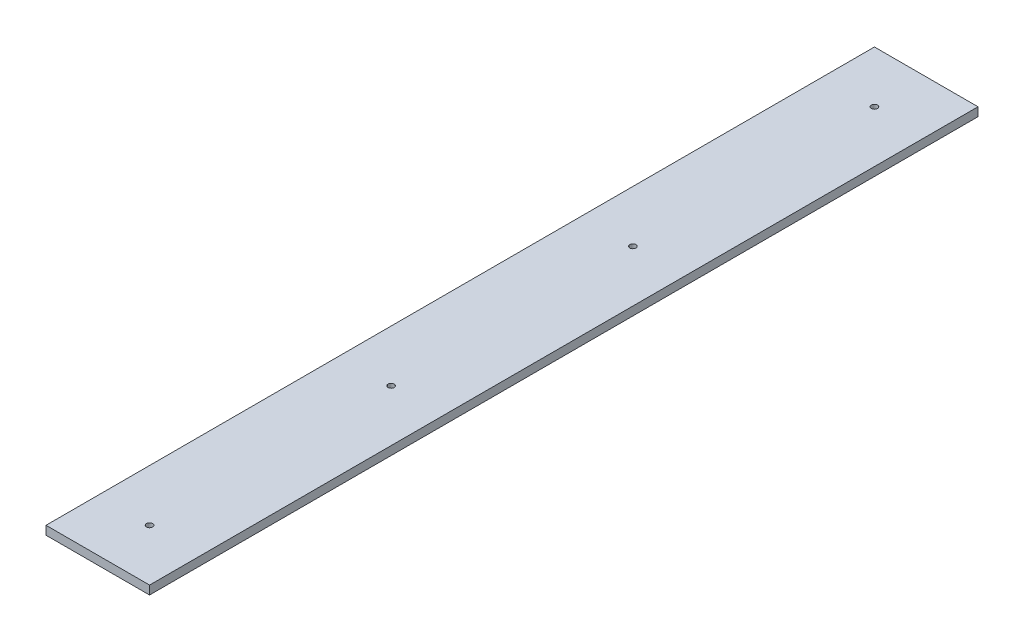
ISO-10303-21;
HEADER;
FILE_DESCRIPTION(('STEP AP214'),'2;1');
FILE_NAME('part.step','',(''),(''),'','','');
FILE_SCHEMA(('AUTOMOTIVE_DESIGN { 1 0 10303 214 1 1 1 1 }'));
ENDSEC;
DATA;
#1=APPLICATION_CONTEXT('core data for automotive mechanical design processes');
#2=APPLICATION_PROTOCOL_DEFINITION('international standard','automotive_design',2000,#1);
#3=PRODUCT_CONTEXT('',#1,'mechanical');
#4=PRODUCT('Part','Part','',(#3));
#5=PRODUCT_RELATED_PRODUCT_CATEGORY('part','',(#4));
#6=PRODUCT_DEFINITION_FORMATION('','',#4);
#7=PRODUCT_DEFINITION_CONTEXT('part definition',#1,'design');
#8=PRODUCT_DEFINITION('design','',#6,#7);
#9=PRODUCT_DEFINITION_SHAPE('','',#8);
#10=(LENGTH_UNIT() NAMED_UNIT(*) SI_UNIT(.MILLI.,.METRE.));
#11=(NAMED_UNIT(*) PLANE_ANGLE_UNIT() SI_UNIT($,.RADIAN.));
#12=(NAMED_UNIT(*) SI_UNIT($,.STERADIAN.) SOLID_ANGLE_UNIT());
#13=UNCERTAINTY_MEASURE_WITH_UNIT(LENGTH_MEASURE(1.E-05),#10,'distance_accuracy_value','');
#14=(GEOMETRIC_REPRESENTATION_CONTEXT(3) GLOBAL_UNCERTAINTY_ASSIGNED_CONTEXT((#13)) GLOBAL_UNIT_ASSIGNED_CONTEXT((#10,
#11,#12)) REPRESENTATION_CONTEXT('',''));
#15=CARTESIAN_POINT('',(0.,0.,0.));
#16=DIRECTION('',(0.,0.,1.));
#17=DIRECTION('',(1.,0.,0.));
#18=AXIS2_PLACEMENT_3D('',#15,#16,#17);
#19=CARTESIAN_POINT('',(0.,6.35,0.));
#20=DIRECTION('',(1.,0.,0.));
#21=DIRECTION('',(0.,0.,-1.));
#22=AXIS2_PLACEMENT_3D('',#19,#20,#21);
#23=PLANE('',#22);
#24=DIRECTION('',(0.,0.,1.));
#25=VECTOR('',#24,1.);
#26=CARTESIAN_POINT('',(0.,0.,0.));
#27=LINE('',#26,#25);
#28=CARTESIAN_POINT('',(0.,0.,-609.6));
#29=VERTEX_POINT('',#28);
#30=CARTESIAN_POINT('',(0.,0.,0.));
#31=VERTEX_POINT('',#30);
#32=EDGE_CURVE('E97',#29,#31,#27,.T.);
#33=ORIENTED_EDGE('',*,*,#32,.T.);
#34=DIRECTION('',(0.,-1.,0.));
#35=VECTOR('',#34,1.);
#36=CARTESIAN_POINT('',(0.,6.35,0.));
#37=LINE('',#36,#35);
#38=CARTESIAN_POINT('',(0.,6.35,0.));
#39=VERTEX_POINT('',#38);
#40=EDGE_CURVE('E11',#39,#31,#37,.T.);
#41=ORIENTED_EDGE('',*,*,#40,.F.);
#42=DIRECTION('',(0.,0.,1.));
#43=VECTOR('',#42,1.);
#44=CARTESIAN_POINT('',(0.,6.35,0.));
#45=LINE('',#44,#43);
#46=CARTESIAN_POINT('',(0.,6.35,-609.6));
#47=VERTEX_POINT('',#46);
#48=EDGE_CURVE('E85',#47,#39,#45,.T.);
#49=ORIENTED_EDGE('',*,*,#48,.F.);
#50=DIRECTION('',(0.,-1.,0.));
#51=VECTOR('',#50,1.);
#52=CARTESIAN_POINT('',(0.,6.35,-609.6));
#53=LINE('',#52,#51);
#54=EDGE_CURVE('E93',#47,#29,#53,.T.);
#55=ORIENTED_EDGE('',*,*,#54,.T.);
#56=EDGE_LOOP('',(#33,#41,#49,#55));
#57=FACE_BOUND('',#56,.T.);
#58=ADVANCED_FACE('F34',(#57),#23,.F.);
#59=CARTESIAN_POINT('',(0.,6.35,0.));
#60=DIRECTION('',(0.,0.,-1.));
#61=DIRECTION('',(-1.,0.,0.));
#62=AXIS2_PLACEMENT_3D('',#59,#60,#61);
#63=PLANE('',#62);
#64=DIRECTION('',(1.,0.,0.));
#65=VECTOR('',#64,1.);
#66=CARTESIAN_POINT('',(0.,0.,0.));
#67=LINE('',#66,#65);
#68=CARTESIAN_POINT('',(76.2,0.,0.));
#69=VERTEX_POINT('',#68);
#70=EDGE_CURVE('E89',#31,#69,#67,.T.);
#71=ORIENTED_EDGE('',*,*,#70,.T.);
#72=DIRECTION('',(0.,-1.,0.));
#73=VECTOR('',#72,1.);
#74=CARTESIAN_POINT('',(76.2,6.35,0.));
#75=LINE('',#74,#73);
#76=CARTESIAN_POINT('',(76.2,6.35,0.));
#77=VERTEX_POINT('',#76);
#78=EDGE_CURVE('E42',#77,#69,#75,.T.);
#79=ORIENTED_EDGE('',*,*,#78,.F.);
#80=DIRECTION('',(1.,0.,0.));
#81=VECTOR('',#80,1.);
#82=CARTESIAN_POINT('',(0.,6.35,0.));
#83=LINE('',#82,#81);
#84=EDGE_CURVE('E80',#39,#77,#83,.T.);
#85=ORIENTED_EDGE('',*,*,#84,.F.);
#86=ORIENTED_EDGE('',*,*,#40,.T.);
#87=EDGE_LOOP('',(#71,#79,#85,#86));
#88=FACE_BOUND('',#87,.T.);
#89=ADVANCED_FACE('F88',(#88),#63,.F.);
#90=CARTESIAN_POINT('',(76.2,6.35,0.));
#91=DIRECTION('',(-1.,0.,0.));
#92=DIRECTION('',(0.,0.,1.));
#93=AXIS2_PLACEMENT_3D('',#90,#91,#92);
#94=PLANE('',#93);
#95=DIRECTION('',(0.,0.,-1.));
#96=VECTOR('',#95,1.);
#97=CARTESIAN_POINT('',(76.2,0.,0.));
#98=LINE('',#97,#96);
#99=CARTESIAN_POINT('',(76.2,0.,-609.6));
#100=VERTEX_POINT('',#99);
#101=EDGE_CURVE('E67',#69,#100,#98,.T.);
#102=ORIENTED_EDGE('',*,*,#101,.T.);
#103=DIRECTION('',(0.,-1.,0.));
#104=VECTOR('',#103,1.);
#105=CARTESIAN_POINT('',(76.2,6.35,-609.6));
#106=LINE('',#105,#104);
#107=CARTESIAN_POINT('',(76.2,6.35,-609.6));
#108=VERTEX_POINT('',#107);
#109=EDGE_CURVE('E90',#108,#100,#106,.T.);
#110=ORIENTED_EDGE('',*,*,#109,.F.);
#111=DIRECTION('',(0.,0.,-1.));
#112=VECTOR('',#111,1.);
#113=CARTESIAN_POINT('',(76.2,6.35,0.));
#114=LINE('',#113,#112);
#115=EDGE_CURVE('E83',#77,#108,#114,.T.);
#116=ORIENTED_EDGE('',*,*,#115,.F.);
#117=ORIENTED_EDGE('',*,*,#78,.T.);
#118=EDGE_LOOP('',(#102,#110,#116,#117));
#119=FACE_BOUND('',#118,.T.);
#120=ADVANCED_FACE('F91',(#119),#94,.F.);
#121=CARTESIAN_POINT('',(0.,6.35,-609.6));
#122=DIRECTION('',(0.,0.,1.));
#123=DIRECTION('',(1.,0.,0.));
#124=AXIS2_PLACEMENT_3D('',#121,#122,#123);
#125=PLANE('',#124);
#126=DIRECTION('',(-1.,0.,0.));
#127=VECTOR('',#126,1.);
#128=CARTESIAN_POINT('',(0.,0.,-609.6));
#129=LINE('',#128,#127);
#130=EDGE_CURVE('E73',#100,#29,#129,.T.);
#131=ORIENTED_EDGE('',*,*,#130,.T.);
#132=ORIENTED_EDGE('',*,*,#54,.F.);
#133=DIRECTION('',(-1.,0.,0.));
#134=VECTOR('',#133,1.);
#135=CARTESIAN_POINT('',(0.,6.35,-609.6));
#136=LINE('',#135,#134);
#137=EDGE_CURVE('E50',#108,#47,#136,.T.);
#138=ORIENTED_EDGE('',*,*,#137,.F.);
#139=ORIENTED_EDGE('',*,*,#109,.T.);
#140=EDGE_LOOP('',(#131,#132,#138,#139));
#141=FACE_BOUND('',#140,.T.);
#142=ADVANCED_FACE('F105',(#141),#125,.F.);
#143=CARTESIAN_POINT('',(0.,6.35,0.));
#144=DIRECTION('',(0.,-1.,0.));
#145=DIRECTION('',(0.,0.,-1.));
#146=AXIS2_PLACEMENT_3D('',#143,#144,#145);
#147=PLANE('',#146);
#148=CARTESIAN_POINT('',(38.1,6.35,-38.1));
#149=DIRECTION('',(0.,1.,0.));
#150=DIRECTION('',(0.,0.,1.));
#151=AXIS2_PLACEMENT_3D('',#148,#149,#150);
#152=CIRCLE('',#151,2.2479);
#153=CARTESIAN_POINT('',(38.1,6.35,-35.8521));
#154=VERTEX_POINT('',#153);
#155=EDGE_CURVE('E131',#154,#154,#152,.T.);
#156=ORIENTED_EDGE('',*,*,#155,.F.);
#157=EDGE_LOOP('',(#156));
#158=FACE_BOUND('',#157,.T.);
#159=CARTESIAN_POINT('',(38.1,6.35,-215.9));
#160=DIRECTION('',(0.,1.,0.));
#161=DIRECTION('',(0.,0.,1.));
#162=AXIS2_PLACEMENT_3D('',#159,#160,#161);
#163=CIRCLE('',#162,2.2479);
#164=CARTESIAN_POINT('',(38.1,6.35,-213.6521));
#165=VERTEX_POINT('',#164);
#166=EDGE_CURVE('E125',#165,#165,#163,.T.);
#167=ORIENTED_EDGE('',*,*,#166,.F.);
#168=EDGE_LOOP('',(#167));
#169=FACE_BOUND('',#168,.T.);
#170=CARTESIAN_POINT('',(38.1,6.35,-393.7));
#171=DIRECTION('',(0.,1.,0.));
#172=DIRECTION('',(0.,0.,1.));
#173=AXIS2_PLACEMENT_3D('',#170,#171,#172);
#174=CIRCLE('',#173,2.2479);
#175=CARTESIAN_POINT('',(38.1,6.35,-391.4521));
#176=VERTEX_POINT('',#175);
#177=EDGE_CURVE('E119',#176,#176,#174,.T.);
#178=ORIENTED_EDGE('',*,*,#177,.F.);
#179=EDGE_LOOP('',(#178));
#180=FACE_BOUND('',#179,.T.);
#181=CARTESIAN_POINT('',(38.1,6.35,-571.5));
#182=DIRECTION('',(0.,1.,0.));
#183=DIRECTION('',(0.,0.,1.));
#184=AXIS2_PLACEMENT_3D('',#181,#182,#183);
#185=CIRCLE('',#184,2.2479);
#186=CARTESIAN_POINT('',(38.1,6.35,-569.2521));
#187=VERTEX_POINT('',#186);
#188=EDGE_CURVE('E113',#187,#187,#185,.T.);
#189=ORIENTED_EDGE('',*,*,#188,.F.);
#190=EDGE_LOOP('',(#189));
#191=FACE_BOUND('',#190,.T.);
#192=ORIENTED_EDGE('',*,*,#48,.T.);
#193=ORIENTED_EDGE('',*,*,#84,.T.);
#194=ORIENTED_EDGE('',*,*,#115,.T.);
#195=ORIENTED_EDGE('',*,*,#137,.T.);
#196=EDGE_LOOP('',(#192,#193,#194,#195));
#197=FACE_BOUND('',#196,.T.);
#198=ADVANCED_FACE('F81',(#158,#169,#180,#191,#197),#147,.F.);
#199=CARTESIAN_POINT('',(0.,0.,0.));
#200=DIRECTION('',(0.,-1.,0.));
#201=DIRECTION('',(0.,0.,-1.));
#202=AXIS2_PLACEMENT_3D('',#199,#200,#201);
#203=PLANE('',#202);
#204=CARTESIAN_POINT('',(38.1,0.,-38.1));
#205=DIRECTION('',(0.,1.,0.));
#206=DIRECTION('',(0.,0.,1.));
#207=AXIS2_PLACEMENT_3D('',#204,#205,#206);
#208=CIRCLE('',#207,2.2479);
#209=CARTESIAN_POINT('',(38.1,0.,-35.8521));
#210=VERTEX_POINT('',#209);
#211=EDGE_CURVE('E128',#210,#210,#208,.T.);
#212=ORIENTED_EDGE('',*,*,#211,.T.);
#213=EDGE_LOOP('',(#212));
#214=FACE_BOUND('',#213,.T.);
#215=CARTESIAN_POINT('',(38.1,0.,-215.9));
#216=DIRECTION('',(0.,1.,0.));
#217=DIRECTION('',(0.,0.,1.));
#218=AXIS2_PLACEMENT_3D('',#215,#216,#217);
#219=CIRCLE('',#218,2.2479);
#220=CARTESIAN_POINT('',(38.1,0.,-213.6521));
#221=VERTEX_POINT('',#220);
#222=EDGE_CURVE('E122',#221,#221,#219,.T.);
#223=ORIENTED_EDGE('',*,*,#222,.T.);
#224=EDGE_LOOP('',(#223));
#225=FACE_BOUND('',#224,.T.);
#226=CARTESIAN_POINT('',(38.1,0.,-393.7));
#227=DIRECTION('',(0.,1.,0.));
#228=DIRECTION('',(0.,0.,1.));
#229=AXIS2_PLACEMENT_3D('',#226,#227,#228);
#230=CIRCLE('',#229,2.2479);
#231=CARTESIAN_POINT('',(38.1,0.,-391.4521));
#232=VERTEX_POINT('',#231);
#233=EDGE_CURVE('E116',#232,#232,#230,.T.);
#234=ORIENTED_EDGE('',*,*,#233,.T.);
#235=EDGE_LOOP('',(#234));
#236=FACE_BOUND('',#235,.T.);
#237=CARTESIAN_POINT('',(38.1,0.,-571.5));
#238=DIRECTION('',(0.,1.,0.));
#239=DIRECTION('',(0.,0.,1.));
#240=AXIS2_PLACEMENT_3D('',#237,#238,#239);
#241=CIRCLE('',#240,2.2479);
#242=CARTESIAN_POINT('',(38.1,0.,-569.2521));
#243=VERTEX_POINT('',#242);
#244=EDGE_CURVE('E100',#243,#243,#241,.T.);
#245=ORIENTED_EDGE('',*,*,#244,.T.);
#246=EDGE_LOOP('',(#245));
#247=FACE_BOUND('',#246,.T.);
#248=ORIENTED_EDGE('',*,*,#32,.F.);
#249=ORIENTED_EDGE('',*,*,#130,.F.);
#250=ORIENTED_EDGE('',*,*,#101,.F.);
#251=ORIENTED_EDGE('',*,*,#70,.F.);
#252=EDGE_LOOP('',(#248,#249,#250,#251));
#253=FACE_BOUND('',#252,.T.);
#254=ADVANCED_FACE('F108',(#214,#225,#236,#247,#253),#203,.T.);
#255=CARTESIAN_POINT('',(38.1,6.35,-571.5));
#256=DIRECTION('',(0.,1.,0.));
#257=DIRECTION('',(0.,0.,1.));
#258=AXIS2_PLACEMENT_3D('',#255,#256,#257);
#259=CYLINDRICAL_SURFACE('',#258,2.2479);
#260=ORIENTED_EDGE('',*,*,#244,.F.);
#261=EDGE_LOOP('',(#260));
#262=FACE_BOUND('',#261,.T.);
#263=ORIENTED_EDGE('',*,*,#188,.T.);
#264=EDGE_LOOP('',(#263));
#265=FACE_BOUND('',#264,.T.);
#266=ADVANCED_FACE('F146',(#262,#265),#259,.F.);
#267=CARTESIAN_POINT('',(38.1,6.35,-393.7));
#268=DIRECTION('',(0.,1.,0.));
#269=DIRECTION('',(0.,0.,1.));
#270=AXIS2_PLACEMENT_3D('',#267,#268,#269);
#271=CYLINDRICAL_SURFACE('',#270,2.2479);
#272=ORIENTED_EDGE('',*,*,#233,.F.);
#273=EDGE_LOOP('',(#272));
#274=FACE_BOUND('',#273,.T.);
#275=ORIENTED_EDGE('',*,*,#177,.T.);
#276=EDGE_LOOP('',(#275));
#277=FACE_BOUND('',#276,.T.);
#278=ADVANCED_FACE('F148',(#274,#277),#271,.F.);
#279=CARTESIAN_POINT('',(38.1,6.35,-215.9));
#280=DIRECTION('',(0.,1.,0.));
#281=DIRECTION('',(0.,0.,1.));
#282=AXIS2_PLACEMENT_3D('',#279,#280,#281);
#283=CYLINDRICAL_SURFACE('',#282,2.2479);
#284=ORIENTED_EDGE('',*,*,#222,.F.);
#285=EDGE_LOOP('',(#284));
#286=FACE_BOUND('',#285,.T.);
#287=ORIENTED_EDGE('',*,*,#166,.T.);
#288=EDGE_LOOP('',(#287));
#289=FACE_BOUND('',#288,.T.);
#290=ADVANCED_FACE('F155',(#286,#289),#283,.F.);
#291=CARTESIAN_POINT('',(38.1,6.35,-38.1));
#292=DIRECTION('',(0.,1.,0.));
#293=DIRECTION('',(0.,0.,1.));
#294=AXIS2_PLACEMENT_3D('',#291,#292,#293);
#295=CYLINDRICAL_SURFACE('',#294,2.2479);
#296=ORIENTED_EDGE('',*,*,#211,.F.);
#297=EDGE_LOOP('',(#296));
#298=FACE_BOUND('',#297,.T.);
#299=ORIENTED_EDGE('',*,*,#155,.T.);
#300=EDGE_LOOP('',(#299));
#301=FACE_BOUND('',#300,.T.);
#302=ADVANCED_FACE('F135',(#298,#301),#295,.F.);
#303=CLOSED_SHELL('',(#58,#89,#120,#142,#198,#254,#266,#278,#290,#302));
#304=MANIFOLD_SOLID_BREP('B2',#303);
#305=ADVANCED_BREP_SHAPE_REPRESENTATION('',(#18,#304),#14);
#306=SHAPE_DEFINITION_REPRESENTATION(#9,#305);
ENDSEC;
END-ISO-10303-21;
